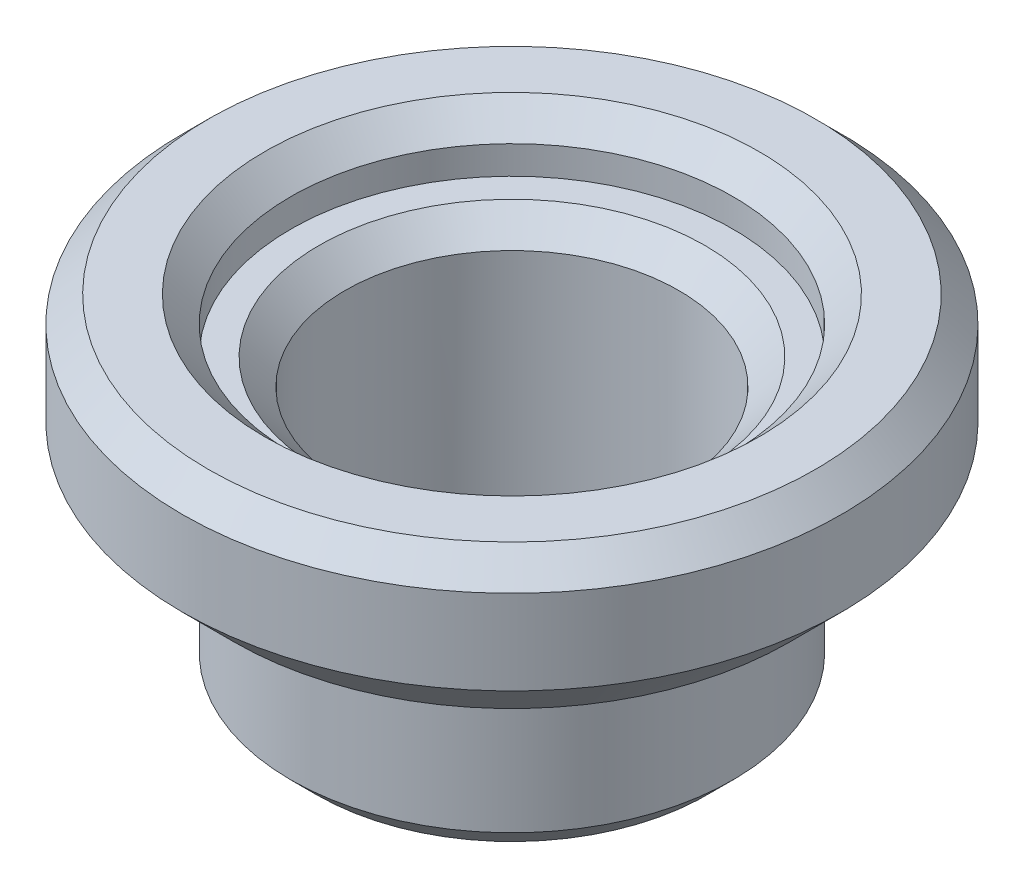
ISO-10303-21;
HEADER;
FILE_DESCRIPTION(('STEP AP214'),'2;1');
FILE_NAME('part.step','',(''),(''),'','','');
FILE_SCHEMA(('AUTOMOTIVE_DESIGN { 1 0 10303 214 1 1 1 1 }'));
ENDSEC;
DATA;
#1=APPLICATION_CONTEXT('core data for automotive mechanical design processes');
#2=APPLICATION_PROTOCOL_DEFINITION('international standard','automotive_design',2000,#1);
#3=PRODUCT_CONTEXT('',#1,'mechanical');
#4=PRODUCT('Part','Part','',(#3));
#5=PRODUCT_RELATED_PRODUCT_CATEGORY('part','',(#4));
#6=PRODUCT_DEFINITION_FORMATION('','',#4);
#7=PRODUCT_DEFINITION_CONTEXT('part definition',#1,'design');
#8=PRODUCT_DEFINITION('design','',#6,#7);
#9=PRODUCT_DEFINITION_SHAPE('','',#8);
#10=(LENGTH_UNIT() NAMED_UNIT(*) SI_UNIT(.MILLI.,.METRE.));
#11=(NAMED_UNIT(*) PLANE_ANGLE_UNIT() SI_UNIT($,.RADIAN.));
#12=(NAMED_UNIT(*) SI_UNIT($,.STERADIAN.) SOLID_ANGLE_UNIT());
#13=UNCERTAINTY_MEASURE_WITH_UNIT(LENGTH_MEASURE(1.E-05),#10,'distance_accuracy_value','');
#14=(GEOMETRIC_REPRESENTATION_CONTEXT(3) GLOBAL_UNCERTAINTY_ASSIGNED_CONTEXT((#13)) GLOBAL_UNIT_ASSIGNED_CONTEXT((#10,
#11,#12)) REPRESENTATION_CONTEXT('',''));
#15=CARTESIAN_POINT('',(0.,0.,0.));
#16=DIRECTION('',(0.,0.,1.));
#17=DIRECTION('',(1.,0.,0.));
#18=AXIS2_PLACEMENT_3D('',#15,#16,#17);
#19=CARTESIAN_POINT('',(0.,3.175,0.));
#20=DIRECTION('',(0.,-1.,0.));
#21=DIRECTION('',(0.,0.,-1.));
#22=AXIS2_PLACEMENT_3D('',#19,#20,#21);
#23=CYLINDRICAL_SURFACE('',#22,9.652);
#24=CARTESIAN_POINT('',(0.,4.00049999999999,0.));
#25=DIRECTION('',(0.,1.,0.));
#26=DIRECTION('',(0.,0.,1.));
#27=AXIS2_PLACEMENT_3D('',#24,#25,#26);
#28=CIRCLE('',#27,9.652);
#29=CARTESIAN_POINT('',(0.,4.00049999999999,9.652));
#30=VERTEX_POINT('',#29);
#31=EDGE_CURVE('E53',#30,#30,#28,.F.);
#32=ORIENTED_EDGE('',*,*,#31,.T.);
#33=EDGE_LOOP('',(#32));
#34=FACE_BOUND('',#33,.T.);
#35=CARTESIAN_POINT('',(0.,1.524,0.));
#36=DIRECTION('',(0.,1.,0.));
#37=DIRECTION('',(0.,0.,1.));
#38=AXIS2_PLACEMENT_3D('',#35,#36,#37);
#39=CIRCLE('',#38,9.652);
#40=CARTESIAN_POINT('',(0.,1.524,9.652));
#41=VERTEX_POINT('',#40);
#42=EDGE_CURVE('E77',#41,#41,#39,.T.);
#43=ORIENTED_EDGE('',*,*,#42,.T.);
#44=EDGE_LOOP('',(#43));
#45=FACE_BOUND('',#44,.T.);
#46=ADVANCED_FACE('F41',(#34,#45),#23,.T.);
#47=CARTESIAN_POINT('',(0.,0.,0.));
#48=DIRECTION('',(0.,1.,0.));
#49=DIRECTION('',(0.,0.,1.));
#50=AXIS2_PLACEMENT_3D('',#47,#48,#49);
#51=PLANE('',#50);
#52=CARTESIAN_POINT('',(0.,0.,0.));
#53=DIRECTION('',(0.,1.,0.));
#54=DIRECTION('',(0.,0.,1.));
#55=AXIS2_PLACEMENT_3D('',#52,#53,#54);
#56=CIRCLE('',#55,8.12799999999999);
#57=CARTESIAN_POINT('',(0.,0.,8.12799999999999));
#58=VERTEX_POINT('',#57);
#59=EDGE_CURVE('E74',#58,#58,#56,.F.);
#60=ORIENTED_EDGE('',*,*,#59,.T.);
#61=EDGE_LOOP('',(#60));
#62=FACE_BOUND('',#61,.T.);
#63=CARTESIAN_POINT('',(0.,0.,0.));
#64=DIRECTION('',(0.,1.,0.));
#65=DIRECTION('',(0.,0.,1.));
#66=AXIS2_PLACEMENT_3D('',#63,#64,#65);
#67=CIRCLE('',#66,6.477);
#68=CARTESIAN_POINT('',(0.,0.,6.477));
#69=VERTEX_POINT('',#68);
#70=EDGE_CURVE('E80',#69,#69,#67,.F.);
#71=ORIENTED_EDGE('',*,*,#70,.F.);
#72=EDGE_LOOP('',(#71));
#73=FACE_BOUND('',#72,.T.);
#74=ADVANCED_FACE('F107',(#62,#73),#51,.F.);
#75=CARTESIAN_POINT('',(0.,4.7625,0.));
#76=DIRECTION('',(0.,1.,0.));
#77=DIRECTION('',(0.,0.,1.));
#78=AXIS2_PLACEMENT_3D('',#75,#76,#77);
#79=PLANE('',#78);
#80=CARTESIAN_POINT('',(0.,4.7625,0.));
#81=DIRECTION('',(0.,1.,0.));
#82=DIRECTION('',(0.,0.,1.));
#83=AXIS2_PLACEMENT_3D('',#80,#81,#82);
#84=CIRCLE('',#83,7.239);
#85=CARTESIAN_POINT('',(0.,4.7625,7.239));
#86=VERTEX_POINT('',#85);
#87=EDGE_CURVE('E57',#86,#86,#84,.F.);
#88=ORIENTED_EDGE('',*,*,#87,.T.);
#89=EDGE_LOOP('',(#88));
#90=FACE_BOUND('',#89,.T.);
#91=CARTESIAN_POINT('',(0.,4.7625,0.));
#92=DIRECTION('',(0.,1.,0.));
#93=DIRECTION('',(0.,0.,1.));
#94=AXIS2_PLACEMENT_3D('',#91,#92,#93);
#95=CIRCLE('',#94,8.89);
#96=CARTESIAN_POINT('',(0.,4.7625,8.89));
#97=VERTEX_POINT('',#96);
#98=EDGE_CURVE('E62',#97,#97,#95,.T.);
#99=ORIENTED_EDGE('',*,*,#98,.T.);
#100=EDGE_LOOP('',(#99));
#101=FACE_BOUND('',#100,.T.);
#102=ADVANCED_FACE('F113',(#90,#101),#79,.T.);
#103=CARTESIAN_POINT('',(0.,4.7625,0.));
#104=DIRECTION('',(0.,-1.,0.));
#105=DIRECTION('',(0.,0.,-1.));
#106=AXIS2_PLACEMENT_3D('',#103,#104,#105);
#107=CYLINDRICAL_SURFACE('',#106,6.477);
#108=CARTESIAN_POINT('',(0.,4.0005,0.));
#109=DIRECTION('',(0.,1.,0.));
#110=DIRECTION('',(0.,0.,1.));
#111=AXIS2_PLACEMENT_3D('',#108,#109,#110);
#112=CIRCLE('',#111,6.477);
#113=CARTESIAN_POINT('',(0.,4.0005,6.477));
#114=VERTEX_POINT('',#113);
#115=EDGE_CURVE('E65',#114,#114,#112,.T.);
#116=ORIENTED_EDGE('',*,*,#115,.T.);
#117=EDGE_LOOP('',(#116));
#118=FACE_BOUND('',#117,.T.);
#119=CARTESIAN_POINT('',(0.,3.175,0.));
#120=DIRECTION('',(0.,1.,0.));
#121=DIRECTION('',(0.,0.,1.));
#122=AXIS2_PLACEMENT_3D('',#119,#120,#121);
#123=CIRCLE('',#122,6.477);
#124=CARTESIAN_POINT('',(0.,3.175,6.477));
#125=VERTEX_POINT('',#124);
#126=EDGE_CURVE('E83',#125,#125,#123,.F.);
#127=ORIENTED_EDGE('',*,*,#126,.T.);
#128=EDGE_LOOP('',(#127));
#129=FACE_BOUND('',#128,.T.);
#130=ADVANCED_FACE('F102',(#118,#129),#107,.F.);
#131=CARTESIAN_POINT('',(0.,3.175,0.));
#132=DIRECTION('',(0.,1.,0.));
#133=DIRECTION('',(0.,0.,1.));
#134=AXIS2_PLACEMENT_3D('',#131,#132,#133);
#135=PLANE('',#134);
#136=CARTESIAN_POINT('',(0.,3.175,0.));
#137=DIRECTION('',(0.,1.,0.));
#138=DIRECTION('',(0.,0.,1.));
#139=AXIS2_PLACEMENT_3D('',#136,#137,#138);
#140=CIRCLE('',#139,5.6515);
#141=CARTESIAN_POINT('',(0.,3.175,5.6515));
#142=VERTEX_POINT('',#141);
#143=EDGE_CURVE('E68',#142,#142,#140,.F.);
#144=ORIENTED_EDGE('',*,*,#143,.T.);
#145=EDGE_LOOP('',(#144));
#146=FACE_BOUND('',#145,.T.);
#147=ORIENTED_EDGE('',*,*,#126,.F.);
#148=EDGE_LOOP('',(#147));
#149=FACE_BOUND('',#148,.T.);
#150=ADVANCED_FACE('F95',(#146,#149),#135,.T.);
#151=CARTESIAN_POINT('',(0.,-5.08,0.));
#152=DIRECTION('',(0.,-1.,0.));
#153=DIRECTION('',(0.,0.,-1.));
#154=AXIS2_PLACEMENT_3D('',#151,#152,#153);
#155=PLANE('',#154);
#156=CARTESIAN_POINT('',(0.,-5.08,0.));
#157=DIRECTION('',(0.,-1.,0.));
#158=DIRECTION('',(0.,0.,-1.));
#159=AXIS2_PLACEMENT_3D('',#156,#157,#158);
#160=CIRCLE('',#159,5.715);
#161=CARTESIAN_POINT('',(0.,-5.08,5.715));
#162=VERTEX_POINT('',#161);
#163=EDGE_CURVE('E49',#162,#162,#160,.T.);
#164=ORIENTED_EDGE('',*,*,#163,.T.);
#165=EDGE_LOOP('',(#164));
#166=FACE_BOUND('',#165,.T.);
#167=CARTESIAN_POINT('',(0.,-5.08,0.));
#168=DIRECTION('',(0.,-1.,0.));
#169=DIRECTION('',(0.,0.,-1.));
#170=AXIS2_PLACEMENT_3D('',#167,#168,#169);
#171=CIRCLE('',#170,4.8895);
#172=CARTESIAN_POINT('',(0.,-5.08,-4.8895));
#173=VERTEX_POINT('',#172);
#174=EDGE_CURVE('E86',#173,#173,#171,.T.);
#175=ORIENTED_EDGE('',*,*,#174,.F.);
#176=EDGE_LOOP('',(#175));
#177=FACE_BOUND('',#176,.T.);
#178=ADVANCED_FACE('F92',(#166,#177),#155,.T.);
#179=CARTESIAN_POINT('',(0.,-5.08,0.));
#180=DIRECTION('',(0.,1.,0.));
#181=DIRECTION('',(0.,0.,1.));
#182=AXIS2_PLACEMENT_3D('',#179,#180,#181);
#183=CYLINDRICAL_SURFACE('',#182,6.477);
#184=CARTESIAN_POINT('',(0.,-4.318,0.));
#185=DIRECTION('',(0.,-1.,0.));
#186=DIRECTION('',(0.,0.,-1.));
#187=AXIS2_PLACEMENT_3D('',#184,#185,#186);
#188=CIRCLE('',#187,6.477);
#189=CARTESIAN_POINT('',(0.,-4.318,6.477));
#190=VERTEX_POINT('',#189);
#191=EDGE_CURVE('E11',#190,#190,#188,.F.);
#192=ORIENTED_EDGE('',*,*,#191,.T.);
#193=EDGE_LOOP('',(#192));
#194=FACE_BOUND('',#193,.T.);
#195=ORIENTED_EDGE('',*,*,#70,.T.);
#196=EDGE_LOOP('',(#195));
#197=FACE_BOUND('',#196,.T.);
#198=ADVANCED_FACE('F94',(#194,#197),#183,.T.);
#199=CARTESIAN_POINT('',(0.,-5.08,0.));
#200=DIRECTION('',(0.,1.,0.));
#201=DIRECTION('',(0.,0.,1.));
#202=AXIS2_PLACEMENT_3D('',#199,#200,#201);
#203=CYLINDRICAL_SURFACE('',#202,4.8895);
#204=CARTESIAN_POINT('',(0.,2.413,0.));
#205=DIRECTION('',(0.,1.,0.));
#206=DIRECTION('',(0.,0.,1.));
#207=AXIS2_PLACEMENT_3D('',#204,#205,#206);
#208=CIRCLE('',#207,4.8895);
#209=CARTESIAN_POINT('',(0.,2.413,4.8895));
#210=VERTEX_POINT('',#209);
#211=EDGE_CURVE('E71',#210,#210,#208,.T.);
#212=ORIENTED_EDGE('',*,*,#211,.T.);
#213=EDGE_LOOP('',(#212));
#214=FACE_BOUND('',#213,.T.);
#215=ORIENTED_EDGE('',*,*,#174,.T.);
#216=EDGE_LOOP('',(#215));
#217=FACE_BOUND('',#216,.T.);
#218=ADVANCED_FACE('F90',(#214,#217),#203,.F.);
#219=CARTESIAN_POINT('',(0.,1.524,0.));
#220=DIRECTION('',(0.,1.,0.));
#221=DIRECTION('',(0.,0.,1.));
#222=AXIS2_PLACEMENT_3D('',#219,#220,#221);
#223=CONICAL_SURFACE('',#222,9.652,0.785398163397451);
#224=ORIENTED_EDGE('',*,*,#59,.F.);
#225=EDGE_LOOP('',(#224));
#226=FACE_BOUND('',#225,.T.);
#227=ORIENTED_EDGE('',*,*,#42,.F.);
#228=EDGE_LOOP('',(#227));
#229=FACE_BOUND('',#228,.T.);
#230=ADVANCED_FACE('F119',(#226,#229),#223,.T.);
#231=CARTESIAN_POINT('',(0.,2.413,0.));
#232=DIRECTION('',(0.,1.,0.));
#233=DIRECTION('',(0.,0.,1.));
#234=AXIS2_PLACEMENT_3D('',#231,#232,#233);
#235=CONICAL_SURFACE('',#234,4.8895,0.785398163397448);
#236=CARTESIAN_POINT('',(0.,3.175,5.6515));
#237=CARTESIAN_POINT('',(0.,3.1670625,5.6435625));
#238=CARTESIAN_POINT('',(0.,3.159125,5.635625));
#239=CARTESIAN_POINT('',(0.,3.14325,5.61975));
#240=CARTESIAN_POINT('',(0.,3.1353125,5.6118125));
#241=CARTESIAN_POINT('',(0.,3.1194375,5.5959375));
#242=CARTESIAN_POINT('',(0.,3.1115,5.588));
#243=CARTESIAN_POINT('',(0.,3.095625,5.572125));
#244=CARTESIAN_POINT('',(0.,3.0876875,5.5641875));
#245=CARTESIAN_POINT('',(0.,3.0718125,5.5483125));
#246=CARTESIAN_POINT('',(0.,3.063875,5.540375));
#247=CARTESIAN_POINT('',(0.,3.048,5.5245));
#248=CARTESIAN_POINT('',(0.,3.0400625,5.5165625));
#249=CARTESIAN_POINT('',(0.,3.0241875,5.5006875));
#250=CARTESIAN_POINT('',(0.,3.01625,5.49275));
#251=CARTESIAN_POINT('',(0.,3.000375,5.476875));
#252=CARTESIAN_POINT('',(0.,2.9924375,5.4689375));
#253=CARTESIAN_POINT('',(0.,2.9765625,5.4530625));
#254=CARTESIAN_POINT('',(0.,2.968625,5.445125));
#255=CARTESIAN_POINT('',(0.,2.95275,5.42925));
#256=CARTESIAN_POINT('',(0.,2.9448125,5.4213125));
#257=CARTESIAN_POINT('',(0.,2.9289375,5.4054375));
#258=CARTESIAN_POINT('',(0.,2.921,5.3975));
#259=CARTESIAN_POINT('',(0.,2.905125,5.381625));
#260=CARTESIAN_POINT('',(0.,2.8971875,5.3736875));
#261=CARTESIAN_POINT('',(0.,2.8813125,5.3578125));
#262=CARTESIAN_POINT('',(0.,2.873375,5.349875));
#263=CARTESIAN_POINT('',(0.,2.8575,5.334));
#264=CARTESIAN_POINT('',(0.,2.8495625,5.3260625));
#265=CARTESIAN_POINT('',(0.,2.8336875,5.3101875));
#266=CARTESIAN_POINT('',(0.,2.82575,5.30225));
#267=CARTESIAN_POINT('',(0.,2.809875,5.286375));
#268=CARTESIAN_POINT('',(0.,2.8019375,5.2784375));
#269=CARTESIAN_POINT('',(0.,2.7860625,5.2625625));
#270=CARTESIAN_POINT('',(0.,2.778125,5.254625));
#271=CARTESIAN_POINT('',(0.,2.76225,5.23875));
#272=CARTESIAN_POINT('',(0.,2.7543125,5.2308125));
#273=CARTESIAN_POINT('',(0.,2.7384375,5.2149375));
#274=CARTESIAN_POINT('',(0.,2.7305,5.207));
#275=CARTESIAN_POINT('',(0.,2.714625,5.191125));
#276=CARTESIAN_POINT('',(0.,2.7066875,5.1831875));
#277=CARTESIAN_POINT('',(0.,2.6908125,5.1673125));
#278=CARTESIAN_POINT('',(0.,2.682875,5.159375));
#279=CARTESIAN_POINT('',(0.,2.667,5.1435));
#280=CARTESIAN_POINT('',(0.,2.6590625,5.1355625));
#281=CARTESIAN_POINT('',(0.,2.6431875,5.1196875));
#282=CARTESIAN_POINT('',(0.,2.63525,5.11175));
#283=CARTESIAN_POINT('',(0.,2.619375,5.095875));
#284=CARTESIAN_POINT('',(0.,2.6114375,5.0879375));
#285=CARTESIAN_POINT('',(0.,2.5955625,5.0720625));
#286=CARTESIAN_POINT('',(0.,2.587625,5.064125));
#287=CARTESIAN_POINT('',(0.,2.57175,5.04825));
#288=CARTESIAN_POINT('',(0.,2.5638125,5.0403125));
#289=CARTESIAN_POINT('',(0.,2.5479375,5.0244375));
#290=CARTESIAN_POINT('',(0.,2.54,5.0165));
#291=CARTESIAN_POINT('',(0.,2.524125,5.000625));
#292=CARTESIAN_POINT('',(0.,2.5161875,4.9926875));
#293=CARTESIAN_POINT('',(0.,2.5003125,4.9768125));
#294=CARTESIAN_POINT('',(0.,2.492375,4.968875));
#295=CARTESIAN_POINT('',(0.,2.4765,4.953));
#296=CARTESIAN_POINT('',(0.,2.4685625,4.9450625));
#297=CARTESIAN_POINT('',(0.,2.4526875,4.9291875));
#298=CARTESIAN_POINT('',(0.,2.44475,4.92125));
#299=CARTESIAN_POINT('',(0.,2.428875,4.905375));
#300=CARTESIAN_POINT('',(0.,2.4209375,4.8974375));
#301=CARTESIAN_POINT('',(0.,2.413,4.8895));
#302=B_SPLINE_CURVE_WITH_KNOTS('',3,(#236,#237,#238,#239,#240,#241,#242,#243,#244,#245,#246,
#247,#248,#249,#250,#251,#252,#253,#254,#255,#256,#257,#258,#259,#260,#261,#262,#263,#264,#265,
#266,#267,#268,#269,#270,#271,#272,#273,#274,#275,#276,#277,#278,#279,#280,#281,#282,#283,#284,
#285,#286,#287,#288,#289,#290,#291,#292,#293,#294,#295,#296,#297,#298,#299,#300,#301),
.UNSPECIFIED.,.F.,.F.,(4,2,2,2,2,2,2,2,2,2,2,2,2,2,2,2,2,2,2,2,2,2,2,2,2,2,2,2,2,2,2,2,4),(0.,
0.0336759604540096,0.0673519209080185,0.101027881362028,0.134703841816037,0.168379802270047,
0.202055762724057,0.235731723178066,0.269407683632075,0.303083644086084,0.336759604540094,
0.370435564994103,0.404111525448112,0.437787485902122,0.471463446356131,0.50513940681014,
0.53881536726415,0.572491327718159,0.606167288172168,0.639843248626178,0.673519209080187,
0.707195169534196,0.740871129988206,0.774547090442215,0.808223050896225,0.841899011350234,
0.875574971804243,0.909250932258253,0.942926892712262,0.976602853166271,1.01027881362028,
1.04395477407429,1.0776307345283),.UNSPECIFIED.);
#303=EDGE_CURVE('BSEAM125',#142,#210,#302,.T.);
#304=ORIENTED_EDGE('',*,*,#143,.F.);
#305=ORIENTED_EDGE('',*,*,#211,.F.);
#306=ORIENTED_EDGE('',*,*,#303,.T.);
#307=ORIENTED_EDGE('',*,*,#303,.F.);
#308=EDGE_LOOP('',(#304,#306,#305,#307));
#309=FACE_BOUND('',#308,.T.);
#310=ADVANCED_FACE('F125',(#309),#235,.F.);
#311=CARTESIAN_POINT('',(0.,4.0005,0.));
#312=DIRECTION('',(0.,1.,0.));
#313=DIRECTION('',(0.,0.,1.));
#314=AXIS2_PLACEMENT_3D('',#311,#312,#313);
#315=CONICAL_SURFACE('',#314,6.477,0.785398163397449);
#316=ORIENTED_EDGE('',*,*,#87,.F.);
#317=EDGE_LOOP('',(#316));
#318=FACE_BOUND('',#317,.T.);
#319=ORIENTED_EDGE('',*,*,#115,.F.);
#320=EDGE_LOOP('',(#319));
#321=FACE_BOUND('',#320,.T.);
#322=ADVANCED_FACE('F132',(#318,#321),#315,.F.);
#323=CARTESIAN_POINT('',(0.,4.7625,0.));
#324=DIRECTION('',(0.,-1.,0.));
#325=DIRECTION('',(0.,0.,-1.));
#326=AXIS2_PLACEMENT_3D('',#323,#324,#325);
#327=CONICAL_SURFACE('',#326,8.89,0.785398163397445);
#328=ORIENTED_EDGE('',*,*,#31,.F.);
#329=EDGE_LOOP('',(#328));
#330=FACE_BOUND('',#329,.T.);
#331=ORIENTED_EDGE('',*,*,#98,.F.);
#332=EDGE_LOOP('',(#331));
#333=FACE_BOUND('',#332,.T.);
#334=ADVANCED_FACE('F138',(#330,#333),#327,.T.);
#335=CARTESIAN_POINT('',(0.,-5.08,0.));
#336=DIRECTION('',(0.,1.,0.));
#337=DIRECTION('',(0.,0.,1.));
#338=AXIS2_PLACEMENT_3D('',#335,#336,#337);
#339=CONICAL_SURFACE('',#338,5.715,0.785398163397447);
#340=CARTESIAN_POINT('',(0.,-4.318,6.477));
#341=CARTESIAN_POINT('',(0.,-4.3259375,6.4690625));
#342=CARTESIAN_POINT('',(0.,-4.333875,6.461125));
#343=CARTESIAN_POINT('',(0.,-4.34975,6.44525));
#344=CARTESIAN_POINT('',(0.,-4.3576875,6.4373125));
#345=CARTESIAN_POINT('',(0.,-4.3735625,6.4214375));
#346=CARTESIAN_POINT('',(0.,-4.3815,6.4135));
#347=CARTESIAN_POINT('',(0.,-4.397375,6.397625));
#348=CARTESIAN_POINT('',(0.,-4.4053125,6.3896875));
#349=CARTESIAN_POINT('',(0.,-4.4211875,6.3738125));
#350=CARTESIAN_POINT('',(0.,-4.429125,6.365875));
#351=CARTESIAN_POINT('',(0.,-4.445,6.35));
#352=CARTESIAN_POINT('',(0.,-4.4529375,6.3420625));
#353=CARTESIAN_POINT('',(0.,-4.4688125,6.3261875));
#354=CARTESIAN_POINT('',(0.,-4.47675,6.31825));
#355=CARTESIAN_POINT('',(0.,-4.492625,6.302375));
#356=CARTESIAN_POINT('',(0.,-4.5005625,6.2944375));
#357=CARTESIAN_POINT('',(0.,-4.5164375,6.2785625));
#358=CARTESIAN_POINT('',(0.,-4.524375,6.270625));
#359=CARTESIAN_POINT('',(0.,-4.54025,6.25475));
#360=CARTESIAN_POINT('',(0.,-4.5481875,6.2468125));
#361=CARTESIAN_POINT('',(0.,-4.5640625,6.2309375));
#362=CARTESIAN_POINT('',(0.,-4.572,6.223));
#363=CARTESIAN_POINT('',(0.,-4.587875,6.207125));
#364=CARTESIAN_POINT('',(0.,-4.5958125,6.1991875));
#365=CARTESIAN_POINT('',(0.,-4.6116875,6.1833125));
#366=CARTESIAN_POINT('',(0.,-4.619625,6.175375));
#367=CARTESIAN_POINT('',(0.,-4.6355,6.1595));
#368=CARTESIAN_POINT('',(0.,-4.6434375,6.1515625));
#369=CARTESIAN_POINT('',(0.,-4.6593125,6.1356875));
#370=CARTESIAN_POINT('',(0.,-4.66725,6.12775));
#371=CARTESIAN_POINT('',(0.,-4.683125,6.111875));
#372=CARTESIAN_POINT('',(0.,-4.6910625,6.1039375));
#373=CARTESIAN_POINT('',(0.,-4.7069375,6.0880625));
#374=CARTESIAN_POINT('',(0.,-4.714875,6.080125));
#375=CARTESIAN_POINT('',(0.,-4.73075,6.06425));
#376=CARTESIAN_POINT('',(0.,-4.7386875,6.0563125));
#377=CARTESIAN_POINT('',(0.,-4.7545625,6.0404375));
#378=CARTESIAN_POINT('',(0.,-4.7625,6.0325));
#379=CARTESIAN_POINT('',(0.,-4.778375,6.016625));
#380=CARTESIAN_POINT('',(0.,-4.7863125,6.0086875));
#381=CARTESIAN_POINT('',(0.,-4.8021875,5.9928125));
#382=CARTESIAN_POINT('',(0.,-4.810125,5.984875));
#383=CARTESIAN_POINT('',(0.,-4.826,5.969));
#384=CARTESIAN_POINT('',(0.,-4.8339375,5.9610625));
#385=CARTESIAN_POINT('',(0.,-4.8498125,5.9451875));
#386=CARTESIAN_POINT('',(0.,-4.85775,5.93725));
#387=CARTESIAN_POINT('',(0.,-4.873625,5.921375));
#388=CARTESIAN_POINT('',(0.,-4.8815625,5.9134375));
#389=CARTESIAN_POINT('',(0.,-4.8974375,5.8975625));
#390=CARTESIAN_POINT('',(0.,-4.905375,5.889625));
#391=CARTESIAN_POINT('',(0.,-4.92125,5.87375));
#392=CARTESIAN_POINT('',(0.,-4.9291875,5.8658125));
#393=CARTESIAN_POINT('',(0.,-4.9450625,5.8499375));
#394=CARTESIAN_POINT('',(0.,-4.953,5.842));
#395=CARTESIAN_POINT('',(0.,-4.968875,5.826125));
#396=CARTESIAN_POINT('',(0.,-4.9768125,5.8181875));
#397=CARTESIAN_POINT('',(0.,-4.9926875,5.8023125));
#398=CARTESIAN_POINT('',(0.,-5.000625,5.794375));
#399=CARTESIAN_POINT('',(0.,-5.0165,5.7785));
#400=CARTESIAN_POINT('',(0.,-5.0244375,5.7705625));
#401=CARTESIAN_POINT('',(0.,-5.0403125,5.7546875));
#402=CARTESIAN_POINT('',(0.,-5.04825,5.74675));
#403=CARTESIAN_POINT('',(0.,-5.064125,5.730875));
#404=CARTESIAN_POINT('',(0.,-5.0720625,5.7229375));
#405=CARTESIAN_POINT('',(0.,-5.08,5.715));
#406=B_SPLINE_CURVE_WITH_KNOTS('',3,(#340,#341,#342,#343,#344,#345,#346,#347,#348,#349,#350,
#351,#352,#353,#354,#355,#356,#357,#358,#359,#360,#361,#362,#363,#364,#365,#366,#367,#368,#369,
#370,#371,#372,#373,#374,#375,#376,#377,#378,#379,#380,#381,#382,#383,#384,#385,#386,#387,#388,
#389,#390,#391,#392,#393,#394,#395,#396,#397,#398,#399,#400,#401,#402,#403,#404,#405),
.UNSPECIFIED.,.F.,.F.,(4,2,2,2,2,2,2,2,2,2,2,2,2,2,2,2,2,2,2,2,2,2,2,2,2,2,2,2,2,2,2,2,4),(0.,
0.0336759604540087,0.0673519209080179,0.101027881362027,0.134703841816037,0.168379802270046,
0.202055762724055,0.235731723178065,0.269407683632074,0.303083644086083,0.336759604540092,
0.370435564994102,0.404111525448111,0.437787485902121,0.471463446356129,0.505139406810139,
0.538815367264149,0.572491327718158,0.606167288172167,0.639843248626176,0.673519209080186,
0.707195169534195,0.740871129988204,0.774547090442214,0.808223050896223,0.841899011350232,
0.875574971804241,0.909250932258251,0.94292689271226,0.976602853166269,1.01027881362028,
1.04395477407429,1.0776307345283),.UNSPECIFIED.);
#407=EDGE_CURVE('BSEAM44',#190,#162,#406,.T.);
#408=ORIENTED_EDGE('',*,*,#191,.F.);
#409=ORIENTED_EDGE('',*,*,#163,.F.);
#410=ORIENTED_EDGE('',*,*,#407,.T.);
#411=ORIENTED_EDGE('',*,*,#407,.F.);
#412=EDGE_LOOP('',(#408,#410,#409,#411));
#413=FACE_BOUND('',#412,.T.);
#414=ADVANCED_FACE('F44',(#413),#339,.T.);
#415=CLOSED_SHELL('',(#46,#74,#102,#130,#150,#178,#198,#218,#230,#310,#322,#334,#414));
#416=MANIFOLD_SOLID_BREP('B2',#415);
#417=ADVANCED_BREP_SHAPE_REPRESENTATION('',(#18,#416),#14);
#418=SHAPE_DEFINITION_REPRESENTATION(#9,#417);
ENDSEC;
END-ISO-10303-21;
